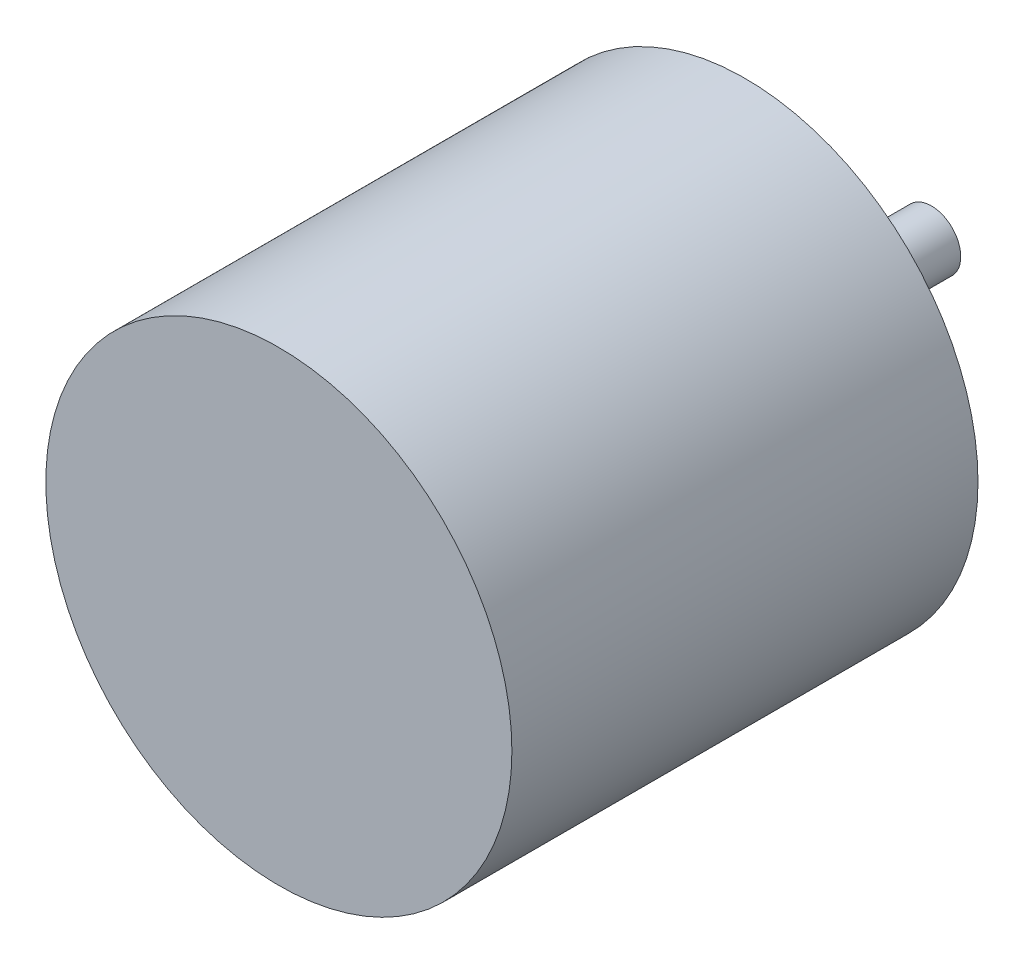
ISO-10303-21;
HEADER;
FILE_DESCRIPTION(('STEP AP214'),'2;1');
FILE_NAME('part.step','',(''),(''),'','','');
FILE_SCHEMA(('AUTOMOTIVE_DESIGN { 1 0 10303 214 1 1 1 1 }'));
ENDSEC;
DATA;
#1=APPLICATION_CONTEXT('core data for automotive mechanical design processes');
#2=APPLICATION_PROTOCOL_DEFINITION('international standard','automotive_design',2000,#1);
#3=PRODUCT_CONTEXT('',#1,'mechanical');
#4=PRODUCT('Part','Part','',(#3));
#5=PRODUCT_RELATED_PRODUCT_CATEGORY('part','',(#4));
#6=PRODUCT_DEFINITION_FORMATION('','',#4);
#7=PRODUCT_DEFINITION_CONTEXT('part definition',#1,'design');
#8=PRODUCT_DEFINITION('design','',#6,#7);
#9=PRODUCT_DEFINITION_SHAPE('','',#8);
#10=(LENGTH_UNIT() NAMED_UNIT(*) SI_UNIT(.MILLI.,.METRE.));
#11=(NAMED_UNIT(*) PLANE_ANGLE_UNIT() SI_UNIT($,.RADIAN.));
#12=(NAMED_UNIT(*) SI_UNIT($,.STERADIAN.) SOLID_ANGLE_UNIT());
#13=UNCERTAINTY_MEASURE_WITH_UNIT(LENGTH_MEASURE(1.E-05),#10,'distance_accuracy_value','');
#14=(GEOMETRIC_REPRESENTATION_CONTEXT(3) GLOBAL_UNCERTAINTY_ASSIGNED_CONTEXT((#13)) GLOBAL_UNIT_ASSIGNED_CONTEXT((#10,
#11,#12)) REPRESENTATION_CONTEXT('',''));
#15=CARTESIAN_POINT('',(0.,0.,0.));
#16=DIRECTION('',(0.,0.,1.));
#17=DIRECTION('',(1.,0.,0.));
#18=AXIS2_PLACEMENT_3D('',#15,#16,#17);
#19=CARTESIAN_POINT('',(0.,0.,25.));
#20=DIRECTION('',(0.,0.,-1.));
#21=DIRECTION('',(-1.,0.,0.));
#22=AXIS2_PLACEMENT_3D('',#19,#20,#21);
#23=CYLINDRICAL_SURFACE('',#22,12.5);
#24=CARTESIAN_POINT('',(0.,0.,25.));
#25=DIRECTION('',(0.,0.,1.));
#26=DIRECTION('',(1.,0.,0.));
#27=AXIS2_PLACEMENT_3D('',#24,#25,#26);
#28=CIRCLE('',#27,12.5);
#29=CARTESIAN_POINT('',(12.5,0.,25.));
#30=VERTEX_POINT('',#29);
#31=EDGE_CURVE('E10',#30,#30,#28,.T.);
#32=ORIENTED_EDGE('',*,*,#31,.F.);
#33=EDGE_LOOP('',(#32));
#34=FACE_BOUND('',#33,.T.);
#35=CARTESIAN_POINT('',(0.,0.,0.));
#36=DIRECTION('',(0.,0.,1.));
#37=DIRECTION('',(1.,0.,0.));
#38=AXIS2_PLACEMENT_3D('',#35,#36,#37);
#39=CIRCLE('',#38,12.5);
#40=CARTESIAN_POINT('',(12.5,0.,0.));
#41=VERTEX_POINT('',#40);
#42=EDGE_CURVE('E36',#41,#41,#39,.T.);
#43=ORIENTED_EDGE('',*,*,#42,.T.);
#44=EDGE_LOOP('',(#43));
#45=FACE_BOUND('',#44,.T.);
#46=ADVANCED_FACE('F33',(#34,#45),#23,.T.);
#47=CARTESIAN_POINT('',(0.,0.,25.));
#48=DIRECTION('',(0.,0.,1.));
#49=DIRECTION('',(1.,0.,0.));
#50=AXIS2_PLACEMENT_3D('',#47,#48,#49);
#51=PLANE('',#50);
#52=ORIENTED_EDGE('',*,*,#31,.T.);
#53=EDGE_LOOP('',(#52));
#54=FACE_BOUND('',#53,.T.);
#55=ADVANCED_FACE('F63',(#54),#51,.T.);
#56=CARTESIAN_POINT('',(0.,0.,0.));
#57=DIRECTION('',(0.,0.,1.));
#58=DIRECTION('',(1.,0.,0.));
#59=AXIS2_PLACEMENT_3D('',#56,#57,#58);
#60=PLANE('',#59);
#61=CARTESIAN_POINT('',(0.,0.,0.));
#62=DIRECTION('',(0.,0.,1.));
#63=DIRECTION('',(1.,0.,0.));
#64=AXIS2_PLACEMENT_3D('',#61,#62,#63);
#65=CIRCLE('',#64,1.57430968466529);
#66=CARTESIAN_POINT('',(1.57430968466529,0.,0.));
#67=VERTEX_POINT('',#66);
#68=EDGE_CURVE('E45',#67,#67,#65,.T.);
#69=ORIENTED_EDGE('',*,*,#68,.T.);
#70=EDGE_LOOP('',(#69));
#71=FACE_BOUND('',#70,.T.);
#72=ORIENTED_EDGE('',*,*,#42,.F.);
#73=EDGE_LOOP('',(#72));
#74=FACE_BOUND('',#73,.T.);
#75=ADVANCED_FACE('F60',(#71,#74),#60,.F.);
#76=CARTESIAN_POINT('',(0.,0.,-10.));
#77=DIRECTION('',(0.,0.,1.));
#78=DIRECTION('',(1.,0.,0.));
#79=AXIS2_PLACEMENT_3D('',#76,#77,#78);
#80=CYLINDRICAL_SURFACE('',#79,1.57430968466529);
#81=CARTESIAN_POINT('',(0.,0.,-10.));
#82=DIRECTION('',(0.,0.,1.));
#83=DIRECTION('',(1.,0.,0.));
#84=AXIS2_PLACEMENT_3D('',#81,#82,#83);
#85=CIRCLE('',#84,1.57430968466529);
#86=CARTESIAN_POINT('',(1.57430968466529,0.,-10.));
#87=VERTEX_POINT('',#86);
#88=EDGE_CURVE('E43',#87,#87,#85,.T.);
#89=ORIENTED_EDGE('',*,*,#88,.T.);
#90=EDGE_LOOP('',(#89));
#91=FACE_BOUND('',#90,.T.);
#92=ORIENTED_EDGE('',*,*,#68,.F.);
#93=EDGE_LOOP('',(#92));
#94=FACE_BOUND('',#93,.T.);
#95=ADVANCED_FACE('F51',(#91,#94),#80,.T.);
#96=CARTESIAN_POINT('',(0.,0.,-10.));
#97=DIRECTION('',(0.,0.,1.));
#98=DIRECTION('',(1.,0.,0.));
#99=AXIS2_PLACEMENT_3D('',#96,#97,#98);
#100=PLANE('',#99);
#101=ORIENTED_EDGE('',*,*,#88,.F.);
#102=EDGE_LOOP('',(#101));
#103=FACE_BOUND('',#102,.T.);
#104=ADVANCED_FACE('F54',(#103),#100,.F.);
#105=CLOSED_SHELL('',(#46,#55,#75,#95,#104));
#106=MANIFOLD_SOLID_BREP('B2',#105);
#107=ADVANCED_BREP_SHAPE_REPRESENTATION('',(#18,#106),#14);
#108=SHAPE_DEFINITION_REPRESENTATION(#9,#107);
ENDSEC;
END-ISO-10303-21;
